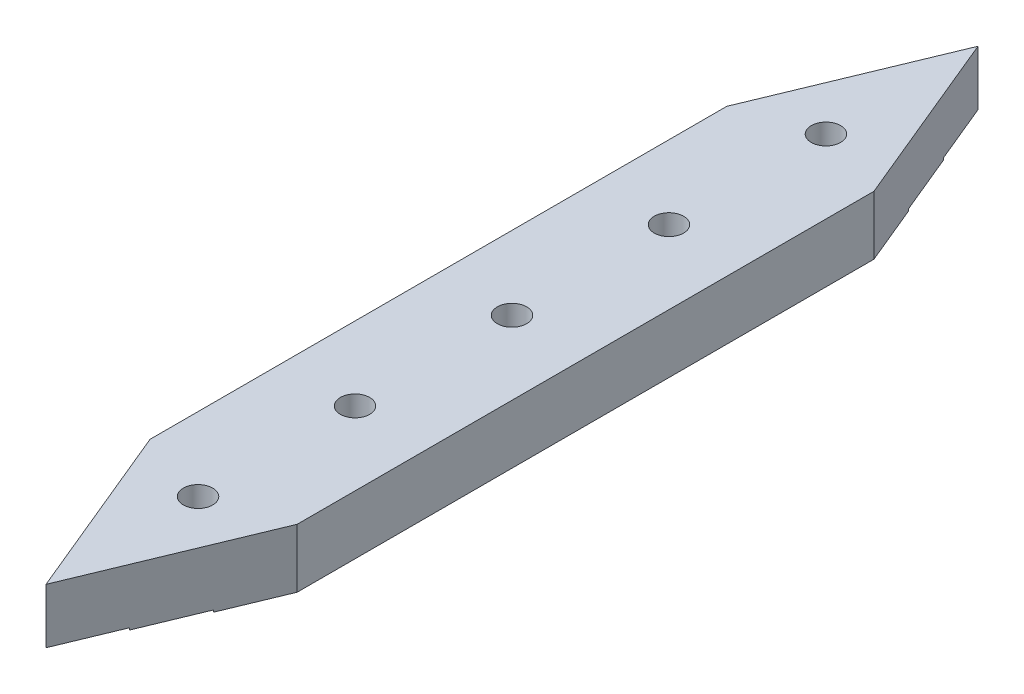
ISO-10303-21;
HEADER;
FILE_DESCRIPTION(('STEP AP214'),'2;1');
FILE_NAME('part.step','',(''),(''),'','','');
FILE_SCHEMA(('AUTOMOTIVE_DESIGN { 1 0 10303 214 1 1 1 1 }'));
ENDSEC;
DATA;
#1=APPLICATION_CONTEXT('core data for automotive mechanical design processes');
#2=APPLICATION_PROTOCOL_DEFINITION('international standard','automotive_design',2000,#1);
#3=PRODUCT_CONTEXT('',#1,'mechanical');
#4=PRODUCT('Part','Part','',(#3));
#5=PRODUCT_RELATED_PRODUCT_CATEGORY('part','',(#4));
#6=PRODUCT_DEFINITION_FORMATION('','',#4);
#7=PRODUCT_DEFINITION_CONTEXT('part definition',#1,'design');
#8=PRODUCT_DEFINITION('design','',#6,#7);
#9=PRODUCT_DEFINITION_SHAPE('','',#8);
#10=(LENGTH_UNIT() NAMED_UNIT(*) SI_UNIT(.MILLI.,.METRE.));
#11=(NAMED_UNIT(*) PLANE_ANGLE_UNIT() SI_UNIT($,.RADIAN.));
#12=(NAMED_UNIT(*) SI_UNIT($,.STERADIAN.) SOLID_ANGLE_UNIT());
#13=UNCERTAINTY_MEASURE_WITH_UNIT(LENGTH_MEASURE(1.E-05),#10,'distance_accuracy_value','');
#14=(GEOMETRIC_REPRESENTATION_CONTEXT(3) GLOBAL_UNCERTAINTY_ASSIGNED_CONTEXT((#13)) GLOBAL_UNIT_ASSIGNED_CONTEXT((#10,
#11,#12)) REPRESENTATION_CONTEXT('',''));
#15=CARTESIAN_POINT('',(0.,0.,0.));
#16=DIRECTION('',(0.,0.,1.));
#17=DIRECTION('',(1.,0.,0.));
#18=AXIS2_PLACEMENT_3D('',#15,#16,#17);
#19=CARTESIAN_POINT('',(0.,0.254,0.));
#20=DIRECTION('',(0.,-1.,0.));
#21=DIRECTION('',(0.,0.,-1.));
#22=AXIS2_PLACEMENT_3D('',#19,#20,#21);
#23=PLANE('',#22);
#24=DIRECTION('',(0.,0.,-1.));
#25=VECTOR('',#24,1.);
#26=CARTESIAN_POINT('',(-3.17499999999999,0.254,0.));
#27=LINE('',#26,#25);
#28=CARTESIAN_POINT('',(-3.175,0.254,52.6598719394655));
#29=VERTEX_POINT('',#28);
#30=CARTESIAN_POINT('',(-3.17499999999999,0.254,-52.6598719394654));
#31=VERTEX_POINT('',#30);
#32=EDGE_CURVE('E46',#29,#31,#27,.T.);
#33=ORIENTED_EDGE('',*,*,#32,.F.);
#34=DIRECTION('',(-0.38268343236509,0.,-0.923879532511287));
#35=VECTOR('',#34,1.);
#36=CARTESIAN_POINT('',(0.,0.254,60.325));
#37=LINE('',#36,#35);
#38=CARTESIAN_POINT('',(-6.35,0.254,44.9947438789308));
#39=VERTEX_POINT('',#38);
#40=EDGE_CURVE('E240',#29,#39,#37,.T.);
#41=ORIENTED_EDGE('',*,*,#40,.T.);
#42=DIRECTION('',(0.,0.,-1.));
#43=VECTOR('',#42,1.);
#44=CARTESIAN_POINT('',(-6.35,0.254,60.325));
#45=LINE('',#44,#43);
#46=CARTESIAN_POINT('',(-6.35000000000004,0.254,-44.9947438789306));
#47=VERTEX_POINT('',#46);
#48=EDGE_CURVE('E158',#39,#47,#45,.T.);
#49=ORIENTED_EDGE('',*,*,#48,.T.);
#50=DIRECTION('',(0.38268343236509,0.,-0.923879532511287));
#51=VECTOR('',#50,1.);
#52=CARTESIAN_POINT('',(0.,0.254,-60.325));
#53=LINE('',#52,#51);
#54=EDGE_CURVE('E242',#47,#31,#53,.T.);
#55=ORIENTED_EDGE('',*,*,#54,.T.);
#56=EDGE_LOOP('',(#33,#41,#49,#55));
#57=FACE_BOUND('',#56,.T.);
#58=ADVANCED_FACE('F37',(#57),#23,.T.);
#59=CARTESIAN_POINT('',(0.,0.,0.));
#60=DIRECTION('',(0.,1.,0.));
#61=DIRECTION('',(0.,0.,1.));
#62=AXIS2_PLACEMENT_3D('',#59,#60,#61);
#63=PLANE('',#62);
#64=DIRECTION('',(-0.38268343236509,0.,0.923879532511287));
#65=VECTOR('',#64,1.);
#66=CARTESIAN_POINT('',(0.,0.,-60.325));
#67=LINE('',#66,#65);
#68=CARTESIAN_POINT('',(-6.34999999999999,0.,-44.9947438789308));
#69=VERTEX_POINT('',#68);
#70=CARTESIAN_POINT('',(-9.52499999999999,0.,-37.3296158183963));
#71=VERTEX_POINT('',#70);
#72=EDGE_CURVE('E263',#69,#71,#67,.T.);
#73=ORIENTED_EDGE('',*,*,#72,.F.);
#74=DIRECTION('',(0.,0.,1.));
#75=VECTOR('',#74,1.);
#76=CARTESIAN_POINT('',(-6.34999999999999,0.,0.));
#77=LINE('',#76,#75);
#78=CARTESIAN_POINT('',(-6.35,0.,44.9947438789309));
#79=VERTEX_POINT('',#78);
#80=EDGE_CURVE('E167',#69,#79,#77,.T.);
#81=ORIENTED_EDGE('',*,*,#80,.T.);
#82=DIRECTION('',(0.38268343236509,0.,0.923879532511287));
#83=VECTOR('',#82,1.);
#84=CARTESIAN_POINT('',(0.,0.,60.325));
#85=LINE('',#84,#83);
#86=CARTESIAN_POINT('',(-9.52499999999999,0.,37.3296158183963));
#87=VERTEX_POINT('',#86);
#88=EDGE_CURVE('E267',#87,#79,#85,.T.);
#89=ORIENTED_EDGE('',*,*,#88,.F.);
#90=DIRECTION('',(0.,0.,1.));
#91=VECTOR('',#90,1.);
#92=CARTESIAN_POINT('',(-9.52499999999999,0.,-37.3296158183963));
#93=LINE('',#92,#91);
#94=EDGE_CURVE('E265',#71,#87,#93,.T.);
#95=ORIENTED_EDGE('',*,*,#94,.F.);
#96=EDGE_LOOP('',(#73,#81,#89,#95));
#97=FACE_BOUND('',#96,.T.);
#98=ADVANCED_FACE('F293',(#97),#63,.F.);
#99=CARTESIAN_POINT('',(0.,7.62,-60.325));
#100=DIRECTION('',(-0.923879532511287,0.,0.38268343236509));
#101=DIRECTION('',(0.38268343236509,0.,0.923879532511287));
#102=AXIS2_PLACEMENT_3D('',#99,#100,#101);
#103=PLANE('',#102);
#104=DIRECTION('',(0.38268343236509,0.,0.923879532511287));
#105=VECTOR('',#104,1.);
#106=CARTESIAN_POINT('',(0.,0.254,-60.325));
#107=LINE('',#106,#105);
#108=CARTESIAN_POINT('',(3.17500000000001,0.254,-52.6598719394654));
#109=VERTEX_POINT('',#108);
#110=CARTESIAN_POINT('',(6.35000000000007,0.254,-44.9947438789305));
#111=VERTEX_POINT('',#110);
#112=EDGE_CURVE('E245',#109,#111,#107,.T.);
#113=ORIENTED_EDGE('',*,*,#112,.F.);
#114=DIRECTION('',(0.,1.,0.));
#115=VECTOR('',#114,1.);
#116=CARTESIAN_POINT('',(3.17500000000001,7.62,-52.6598719394654));
#117=LINE('',#116,#115);
#118=CARTESIAN_POINT('',(3.17500000000006,0.508,-52.6598719394652));
#119=VERTEX_POINT('',#118);
#120=EDGE_CURVE('E54',#109,#119,#117,.T.);
#121=ORIENTED_EDGE('',*,*,#120,.T.);
#122=DIRECTION('',(0.38268343236509,0.,0.923879532511287));
#123=VECTOR('',#122,1.);
#124=CARTESIAN_POINT('',(0.,0.508,-60.325));
#125=LINE('',#124,#123);
#126=CARTESIAN_POINT('',(0.,0.508,-60.325));
#127=VERTEX_POINT('',#126);
#128=EDGE_CURVE('E145',#127,#119,#125,.T.);
#129=ORIENTED_EDGE('',*,*,#128,.F.);
#130=DIRECTION('',(0.,-1.,0.));
#131=VECTOR('',#130,1.);
#132=CARTESIAN_POINT('',(0.,7.62,-60.325));
#133=LINE('',#132,#131);
#134=CARTESIAN_POINT('',(0.,7.62,-60.325));
#135=VERTEX_POINT('',#134);
#136=EDGE_CURVE('E157',#135,#127,#133,.T.);
#137=ORIENTED_EDGE('',*,*,#136,.F.);
#138=DIRECTION('',(-0.38268343236509,0.,-0.923879532511287));
#139=VECTOR('',#138,1.);
#140=CARTESIAN_POINT('',(0.,7.62,-60.325));
#141=LINE('',#140,#139);
#142=CARTESIAN_POINT('',(9.525,7.62,-37.3296158183963));
#143=VERTEX_POINT('',#142);
#144=EDGE_CURVE('E248',#143,#135,#141,.T.);
#145=ORIENTED_EDGE('',*,*,#144,.F.);
#146=DIRECTION('',(0.,-1.,0.));
#147=VECTOR('',#146,1.);
#148=CARTESIAN_POINT('',(9.525,7.62,-37.3296158183963));
#149=LINE('',#148,#147);
#150=CARTESIAN_POINT('',(9.525,0.,-37.3296158183963));
#151=VERTEX_POINT('',#150);
#152=EDGE_CURVE('E260',#143,#151,#149,.T.);
#153=ORIENTED_EDGE('',*,*,#152,.T.);
#154=DIRECTION('',(-0.38268343236509,0.,-0.923879532511287));
#155=VECTOR('',#154,1.);
#156=CARTESIAN_POINT('',(0.,0.,-60.325));
#157=LINE('',#156,#155);
#158=CARTESIAN_POINT('',(6.35000000000001,0.,-44.9947438789308));
#159=VERTEX_POINT('',#158);
#160=EDGE_CURVE('E247',#151,#159,#157,.T.);
#161=ORIENTED_EDGE('',*,*,#160,.T.);
#162=DIRECTION('',(0.,1.,0.));
#163=VECTOR('',#162,1.);
#164=CARTESIAN_POINT('',(6.35000000000001,7.62,-44.9947438789308));
#165=LINE('',#164,#163);
#166=EDGE_CURVE('E62',#159,#111,#165,.T.);
#167=ORIENTED_EDGE('',*,*,#166,.T.);
#168=EDGE_LOOP('',(#113,#121,#129,#137,#145,#153,#161,#167));
#169=FACE_BOUND('',#168,.T.);
#170=ADVANCED_FACE('F39',(#169),#103,.F.);
#171=CARTESIAN_POINT('',(0.,7.62,-60.325));
#172=DIRECTION('',(0.923879532511287,0.,0.38268343236509));
#173=DIRECTION('',(0.38268343236509,0.,-0.923879532511287));
#174=AXIS2_PLACEMENT_3D('',#171,#172,#173);
#175=PLANE('',#174);
#176=DIRECTION('',(0.38268343236509,0.,-0.923879532511287));
#177=VECTOR('',#176,1.);
#178=CARTESIAN_POINT('',(0.,0.508,-60.325));
#179=LINE('',#178,#177);
#180=CARTESIAN_POINT('',(-3.17500000000003,0.508,-52.6598719394652));
#181=VERTEX_POINT('',#180);
#182=EDGE_CURVE('E141',#181,#127,#179,.T.);
#183=ORIENTED_EDGE('',*,*,#182,.F.);
#184=DIRECTION('',(0.,-1.,0.));
#185=VECTOR('',#184,1.);
#186=CARTESIAN_POINT('',(-3.17499999999999,7.62,-52.6598719394655));
#187=LINE('',#186,#185);
#188=EDGE_CURVE('E222',#181,#31,#187,.T.);
#189=ORIENTED_EDGE('',*,*,#188,.T.);
#190=ORIENTED_EDGE('',*,*,#54,.F.);
#191=DIRECTION('',(0.,-1.,0.));
#192=VECTOR('',#191,1.);
#193=CARTESIAN_POINT('',(-6.34999999999999,7.62,-44.9947438789309));
#194=LINE('',#193,#192);
#195=EDGE_CURVE('E237',#47,#69,#194,.T.);
#196=ORIENTED_EDGE('',*,*,#195,.T.);
#197=ORIENTED_EDGE('',*,*,#72,.T.);
#198=DIRECTION('',(0.,-1.,0.));
#199=VECTOR('',#198,1.);
#200=CARTESIAN_POINT('',(-9.52499999999999,7.62,-37.3296158183963));
#201=LINE('',#200,#199);
#202=CARTESIAN_POINT('',(-9.52499999999999,7.62,-37.3296158183963));
#203=VERTEX_POINT('',#202);
#204=EDGE_CURVE('E165',#203,#71,#201,.T.);
#205=ORIENTED_EDGE('',*,*,#204,.F.);
#206=DIRECTION('',(-0.38268343236509,0.,0.923879532511287));
#207=VECTOR('',#206,1.);
#208=CARTESIAN_POINT('',(0.,7.62,-60.325));
#209=LINE('',#208,#207);
#210=EDGE_CURVE('E162',#135,#203,#209,.T.);
#211=ORIENTED_EDGE('',*,*,#210,.F.);
#212=ORIENTED_EDGE('',*,*,#136,.T.);
#213=EDGE_LOOP('',(#183,#189,#190,#196,#197,#205,#211,#212));
#214=FACE_BOUND('',#213,.T.);
#215=ADVANCED_FACE('F160',(#214),#175,.F.);
#216=CARTESIAN_POINT('',(-9.52499999999999,7.62,-37.3296158183963));
#217=DIRECTION('',(1.,0.,0.));
#218=DIRECTION('',(0.,0.,-1.));
#219=AXIS2_PLACEMENT_3D('',#216,#217,#218);
#220=PLANE('',#219);
#221=ORIENTED_EDGE('',*,*,#94,.T.);
#222=DIRECTION('',(0.,-1.,0.));
#223=VECTOR('',#222,1.);
#224=CARTESIAN_POINT('',(-9.52499999999999,7.62,37.3296158183963));
#225=LINE('',#224,#223);
#226=CARTESIAN_POINT('',(-9.52499999999999,7.62,37.3296158183963));
#227=VERTEX_POINT('',#226);
#228=EDGE_CURVE('E170',#227,#87,#225,.T.);
#229=ORIENTED_EDGE('',*,*,#228,.F.);
#230=DIRECTION('',(0.,0.,1.));
#231=VECTOR('',#230,1.);
#232=CARTESIAN_POINT('',(-9.52499999999999,7.62,-37.3296158183963));
#233=LINE('',#232,#231);
#234=EDGE_CURVE('E252',#203,#227,#233,.T.);
#235=ORIENTED_EDGE('',*,*,#234,.F.);
#236=ORIENTED_EDGE('',*,*,#204,.T.);
#237=EDGE_LOOP('',(#221,#229,#235,#236));
#238=FACE_BOUND('',#237,.T.);
#239=ADVANCED_FACE('F345',(#238),#220,.F.);
#240=CARTESIAN_POINT('',(0.,7.62,60.325));
#241=DIRECTION('',(0.923879532511287,0.,-0.38268343236509));
#242=DIRECTION('',(-0.38268343236509,0.,-0.923879532511287));
#243=AXIS2_PLACEMENT_3D('',#240,#241,#242);
#244=PLANE('',#243);
#245=ORIENTED_EDGE('',*,*,#40,.F.);
#246=DIRECTION('',(0.,1.,0.));
#247=VECTOR('',#246,1.);
#248=CARTESIAN_POINT('',(-3.175,7.62,52.6598719394654));
#249=LINE('',#248,#247);
#250=CARTESIAN_POINT('',(-3.175,0.508,52.6598719394654));
#251=VERTEX_POINT('',#250);
#252=EDGE_CURVE('E219',#29,#251,#249,.T.);
#253=ORIENTED_EDGE('',*,*,#252,.T.);
#254=DIRECTION('',(-0.38268343236509,0.,-0.923879532511287));
#255=VECTOR('',#254,1.);
#256=CARTESIAN_POINT('',(0.,0.508,60.325));
#257=LINE('',#256,#255);
#258=CARTESIAN_POINT('',(0.,0.508,60.325));
#259=VERTEX_POINT('',#258);
#260=EDGE_CURVE('E151',#259,#251,#257,.T.);
#261=ORIENTED_EDGE('',*,*,#260,.F.);
#262=DIRECTION('',(0.,-1.,0.));
#263=VECTOR('',#262,1.);
#264=CARTESIAN_POINT('',(0.,7.62,60.325));
#265=LINE('',#264,#263);
#266=CARTESIAN_POINT('',(0.,7.62,60.325));
#267=VERTEX_POINT('',#266);
#268=EDGE_CURVE('E278',#267,#259,#265,.T.);
#269=ORIENTED_EDGE('',*,*,#268,.F.);
#270=DIRECTION('',(0.38268343236509,0.,0.923879532511287));
#271=VECTOR('',#270,1.);
#272=CARTESIAN_POINT('',(0.,7.62,60.325));
#273=LINE('',#272,#271);
#274=EDGE_CURVE('E254',#227,#267,#273,.T.);
#275=ORIENTED_EDGE('',*,*,#274,.F.);
#276=ORIENTED_EDGE('',*,*,#228,.T.);
#277=ORIENTED_EDGE('',*,*,#88,.T.);
#278=DIRECTION('',(0.,1.,0.));
#279=VECTOR('',#278,1.);
#280=CARTESIAN_POINT('',(-6.35,7.62,44.9947438789309));
#281=LINE('',#280,#279);
#282=EDGE_CURVE('E234',#79,#39,#281,.T.);
#283=ORIENTED_EDGE('',*,*,#282,.T.);
#284=EDGE_LOOP('',(#245,#253,#261,#269,#275,#276,#277,#283));
#285=FACE_BOUND('',#284,.T.);
#286=ADVANCED_FACE('F286',(#285),#244,.F.);
#287=CARTESIAN_POINT('',(0.,7.62,60.325));
#288=DIRECTION('',(-0.923879532511287,0.,-0.38268343236509));
#289=DIRECTION('',(-0.38268343236509,0.,0.923879532511287));
#290=AXIS2_PLACEMENT_3D('',#287,#288,#289);
#291=PLANE('',#290);
#292=DIRECTION('',(-0.38268343236509,0.,0.923879532511287));
#293=VECTOR('',#292,1.);
#294=CARTESIAN_POINT('',(0.,0.508,60.325));
#295=LINE('',#294,#293);
#296=CARTESIAN_POINT('',(3.175,0.508,52.6598719394654));
#297=VERTEX_POINT('',#296);
#298=EDGE_CURVE('E11',#297,#259,#295,.T.);
#299=ORIENTED_EDGE('',*,*,#298,.F.);
#300=DIRECTION('',(0.,-1.,0.));
#301=VECTOR('',#300,1.);
#302=CARTESIAN_POINT('',(3.175,7.62,52.6598719394654));
#303=LINE('',#302,#301);
#304=CARTESIAN_POINT('',(3.175,0.254,52.6598719394654));
#305=VERTEX_POINT('',#304);
#306=EDGE_CURVE('E215',#297,#305,#303,.T.);
#307=ORIENTED_EDGE('',*,*,#306,.T.);
#308=DIRECTION('',(-0.38268343236509,0.,0.923879532511287));
#309=VECTOR('',#308,1.);
#310=CARTESIAN_POINT('',(0.,0.254,60.325));
#311=LINE('',#310,#309);
#312=CARTESIAN_POINT('',(6.35,0.254,44.9947438789309));
#313=VERTEX_POINT('',#312);
#314=EDGE_CURVE('E176',#313,#305,#311,.T.);
#315=ORIENTED_EDGE('',*,*,#314,.F.);
#316=DIRECTION('',(0.,-1.,0.));
#317=VECTOR('',#316,1.);
#318=CARTESIAN_POINT('',(6.35,7.62,44.9947438789309));
#319=LINE('',#318,#317);
#320=CARTESIAN_POINT('',(6.35,0.,44.9947438789308));
#321=VERTEX_POINT('',#320);
#322=EDGE_CURVE('E230',#313,#321,#319,.T.);
#323=ORIENTED_EDGE('',*,*,#322,.T.);
#324=DIRECTION('',(0.38268343236509,0.,-0.923879532511287));
#325=VECTOR('',#324,1.);
#326=CARTESIAN_POINT('',(0.,0.,60.325));
#327=LINE('',#326,#325);
#328=CARTESIAN_POINT('',(9.525,0.,37.3296158183963));
#329=VERTEX_POINT('',#328);
#330=EDGE_CURVE('E270',#321,#329,#327,.T.);
#331=ORIENTED_EDGE('',*,*,#330,.T.);
#332=DIRECTION('',(0.,-1.,0.));
#333=VECTOR('',#332,1.);
#334=CARTESIAN_POINT('',(9.525,7.62,37.3296158183963));
#335=LINE('',#334,#333);
#336=CARTESIAN_POINT('',(9.525,7.62,37.3296158183963));
#337=VERTEX_POINT('',#336);
#338=EDGE_CURVE('E275',#337,#329,#335,.T.);
#339=ORIENTED_EDGE('',*,*,#338,.F.);
#340=DIRECTION('',(0.38268343236509,0.,-0.923879532511287));
#341=VECTOR('',#340,1.);
#342=CARTESIAN_POINT('',(0.,7.62,60.325));
#343=LINE('',#342,#341);
#344=EDGE_CURVE('E256',#267,#337,#343,.T.);
#345=ORIENTED_EDGE('',*,*,#344,.F.);
#346=ORIENTED_EDGE('',*,*,#268,.T.);
#347=EDGE_LOOP('',(#299,#307,#315,#323,#331,#339,#345,#346));
#348=FACE_BOUND('',#347,.T.);
#349=ADVANCED_FACE('F340',(#348),#291,.F.);
#350=CARTESIAN_POINT('',(9.525,7.62,-37.3296158183963));
#351=DIRECTION('',(-1.,0.,0.));
#352=DIRECTION('',(0.,0.,1.));
#353=AXIS2_PLACEMENT_3D('',#350,#351,#352);
#354=PLANE('',#353);
#355=DIRECTION('',(0.,0.,-1.));
#356=VECTOR('',#355,1.);
#357=CARTESIAN_POINT('',(9.525,0.,-37.3296158183963));
#358=LINE('',#357,#356);
#359=EDGE_CURVE('E250',#329,#151,#358,.T.);
#360=ORIENTED_EDGE('',*,*,#359,.T.);
#361=ORIENTED_EDGE('',*,*,#152,.F.);
#362=DIRECTION('',(0.,0.,-1.));
#363=VECTOR('',#362,1.);
#364=CARTESIAN_POINT('',(9.525,7.62,-37.3296158183963));
#365=LINE('',#364,#363);
#366=EDGE_CURVE('E258',#337,#143,#365,.T.);
#367=ORIENTED_EDGE('',*,*,#366,.F.);
#368=ORIENTED_EDGE('',*,*,#338,.T.);
#369=EDGE_LOOP('',(#360,#361,#367,#368));
#370=FACE_BOUND('',#369,.T.);
#371=ADVANCED_FACE('F356',(#370),#354,.F.);
#372=CARTESIAN_POINT('',(0.,7.62,0.));
#373=DIRECTION('',(0.,1.,0.));
#374=DIRECTION('',(0.,0.,1.));
#375=AXIS2_PLACEMENT_3D('',#372,#373,#374);
#376=PLANE('',#375);
#377=CARTESIAN_POINT('',(0.,7.62,-20.32));
#378=DIRECTION('',(0.,1.,0.));
#379=DIRECTION('',(0.,0.,1.));
#380=AXIS2_PLACEMENT_3D('',#377,#378,#379);
#381=CIRCLE('',#380,1.89865);
#382=CARTESIAN_POINT('',(0.,7.62,-18.42135));
#383=VERTEX_POINT('',#382);
#384=EDGE_CURVE('E200',#383,#383,#381,.T.);
#385=ORIENTED_EDGE('',*,*,#384,.F.);
#386=EDGE_LOOP('',(#385));
#387=FACE_BOUND('',#386,.T.);
#388=CARTESIAN_POINT('',(0.,7.62,-40.64));
#389=DIRECTION('',(0.,1.,0.));
#390=DIRECTION('',(0.,0.,1.));
#391=AXIS2_PLACEMENT_3D('',#388,#389,#390);
#392=CIRCLE('',#391,1.89865);
#393=CARTESIAN_POINT('',(0.,7.62,-38.74135));
#394=VERTEX_POINT('',#393);
#395=EDGE_CURVE('E189',#394,#394,#392,.T.);
#396=ORIENTED_EDGE('',*,*,#395,.F.);
#397=EDGE_LOOP('',(#396));
#398=FACE_BOUND('',#397,.T.);
#399=CARTESIAN_POINT('',(0.,7.62,0.));
#400=DIRECTION('',(0.,1.,0.));
#401=DIRECTION('',(0.,0.,1.));
#402=AXIS2_PLACEMENT_3D('',#399,#400,#401);
#403=CIRCLE('',#402,1.89865);
#404=CARTESIAN_POINT('',(0.,7.62,1.89865));
#405=VERTEX_POINT('',#404);
#406=EDGE_CURVE('E188',#405,#405,#403,.T.);
#407=ORIENTED_EDGE('',*,*,#406,.F.);
#408=EDGE_LOOP('',(#407));
#409=FACE_BOUND('',#408,.T.);
#410=CARTESIAN_POINT('',(0.,7.62,20.32));
#411=DIRECTION('',(0.,1.,0.));
#412=DIRECTION('',(0.,0.,1.));
#413=AXIS2_PLACEMENT_3D('',#410,#411,#412);
#414=CIRCLE('',#413,1.89865);
#415=CARTESIAN_POINT('',(0.,7.62,22.21865));
#416=VERTEX_POINT('',#415);
#417=EDGE_CURVE('E185',#416,#416,#414,.T.);
#418=ORIENTED_EDGE('',*,*,#417,.F.);
#419=EDGE_LOOP('',(#418));
#420=FACE_BOUND('',#419,.T.);
#421=CARTESIAN_POINT('',(0.,7.62,40.64));
#422=DIRECTION('',(0.,1.,0.));
#423=DIRECTION('',(0.,0.,1.));
#424=AXIS2_PLACEMENT_3D('',#421,#422,#423);
#425=CIRCLE('',#424,1.89865);
#426=CARTESIAN_POINT('',(0.,7.62,42.53865));
#427=VERTEX_POINT('',#426);
#428=EDGE_CURVE('E184',#427,#427,#425,.T.);
#429=ORIENTED_EDGE('',*,*,#428,.F.);
#430=EDGE_LOOP('',(#429));
#431=FACE_BOUND('',#430,.T.);
#432=ORIENTED_EDGE('',*,*,#144,.T.);
#433=ORIENTED_EDGE('',*,*,#210,.T.);
#434=ORIENTED_EDGE('',*,*,#234,.T.);
#435=ORIENTED_EDGE('',*,*,#274,.T.);
#436=ORIENTED_EDGE('',*,*,#344,.T.);
#437=ORIENTED_EDGE('',*,*,#366,.T.);
#438=EDGE_LOOP('',(#432,#433,#434,#435,#436,#437));
#439=FACE_BOUND('',#438,.T.);
#440=ADVANCED_FACE('F331',(#387,#398,#409,#420,#431,#439),#376,.T.);
#441=ORIENTED_EDGE('',*,*,#330,.F.);
#442=DIRECTION('',(0.,0.,-1.));
#443=VECTOR('',#442,1.);
#444=CARTESIAN_POINT('',(6.35000000000001,0.,0.));
#445=LINE('',#444,#443);
#446=EDGE_CURVE('E164',#321,#159,#445,.T.);
#447=ORIENTED_EDGE('',*,*,#446,.T.);
#448=ORIENTED_EDGE('',*,*,#160,.F.);
#449=ORIENTED_EDGE('',*,*,#359,.F.);
#450=EDGE_LOOP('',(#441,#447,#448,#449));
#451=FACE_BOUND('',#450,.T.);
#452=ADVANCED_FACE('F322',(#451),#63,.F.);
#453=DIRECTION('',(0.,0.,1.));
#454=VECTOR('',#453,1.);
#455=CARTESIAN_POINT('',(3.17500000000001,0.254,0.));
#456=LINE('',#455,#454);
#457=EDGE_CURVE('E179',#109,#305,#456,.T.);
#458=ORIENTED_EDGE('',*,*,#457,.F.);
#459=ORIENTED_EDGE('',*,*,#112,.T.);
#460=DIRECTION('',(0.,0.,1.));
#461=VECTOR('',#460,1.);
#462=CARTESIAN_POINT('',(6.35,0.254,60.325));
#463=LINE('',#462,#461);
#464=EDGE_CURVE('E227',#111,#313,#463,.T.);
#465=ORIENTED_EDGE('',*,*,#464,.T.);
#466=ORIENTED_EDGE('',*,*,#314,.T.);
#467=EDGE_LOOP('',(#458,#459,#465,#466));
#468=FACE_BOUND('',#467,.T.);
#469=ADVANCED_FACE('F317',(#468),#23,.T.);
#470=CARTESIAN_POINT('',(-6.35,0.254,60.325));
#471=DIRECTION('',(-1.,0.,0.));
#472=DIRECTION('',(0.,0.,1.));
#473=AXIS2_PLACEMENT_3D('',#470,#471,#472);
#474=PLANE('',#473);
#475=ORIENTED_EDGE('',*,*,#48,.F.);
#476=ORIENTED_EDGE('',*,*,#282,.F.);
#477=ORIENTED_EDGE('',*,*,#80,.F.);
#478=ORIENTED_EDGE('',*,*,#195,.F.);
#479=EDGE_LOOP('',(#475,#476,#477,#478));
#480=FACE_BOUND('',#479,.T.);
#481=ADVANCED_FACE('F296',(#480),#474,.F.);
#482=CARTESIAN_POINT('',(6.35,0.254,60.325));
#483=DIRECTION('',(1.,0.,0.));
#484=DIRECTION('',(0.,0.,-1.));
#485=AXIS2_PLACEMENT_3D('',#482,#483,#484);
#486=PLANE('',#485);
#487=ORIENTED_EDGE('',*,*,#446,.F.);
#488=ORIENTED_EDGE('',*,*,#322,.F.);
#489=ORIENTED_EDGE('',*,*,#464,.F.);
#490=ORIENTED_EDGE('',*,*,#166,.F.);
#491=EDGE_LOOP('',(#487,#488,#489,#490));
#492=FACE_BOUND('',#491,.T.);
#493=ADVANCED_FACE('F312',(#492),#486,.F.);
#494=CARTESIAN_POINT('',(0.,0.508,0.));
#495=DIRECTION('',(0.,-1.,0.));
#496=DIRECTION('',(0.,0.,-1.));
#497=AXIS2_PLACEMENT_3D('',#494,#495,#496);
#498=PLANE('',#497);
#499=CARTESIAN_POINT('',(0.,0.508,-20.32));
#500=DIRECTION('',(0.,-1.,0.));
#501=DIRECTION('',(0.,0.,-1.));
#502=AXIS2_PLACEMENT_3D('',#499,#500,#501);
#503=CIRCLE('',#502,1.89865);
#504=CARTESIAN_POINT('',(0.,0.508,-22.21865));
#505=VERTEX_POINT('',#504);
#506=EDGE_CURVE('E41',#505,#505,#503,.T.);
#507=ORIENTED_EDGE('',*,*,#506,.F.);
#508=EDGE_LOOP('',(#507));
#509=FACE_BOUND('',#508,.T.);
#510=CARTESIAN_POINT('',(0.,0.508,-40.64));
#511=DIRECTION('',(0.,-1.,0.));
#512=DIRECTION('',(0.,0.,-1.));
#513=AXIS2_PLACEMENT_3D('',#510,#511,#512);
#514=CIRCLE('',#513,1.89865);
#515=CARTESIAN_POINT('',(0.,0.508,-42.53865));
#516=VERTEX_POINT('',#515);
#517=EDGE_CURVE('E186',#516,#516,#514,.T.);
#518=ORIENTED_EDGE('',*,*,#517,.F.);
#519=EDGE_LOOP('',(#518));
#520=FACE_BOUND('',#519,.T.);
#521=CARTESIAN_POINT('',(0.,0.508,0.));
#522=DIRECTION('',(0.,-1.,0.));
#523=DIRECTION('',(0.,0.,-1.));
#524=AXIS2_PLACEMENT_3D('',#521,#522,#523);
#525=CIRCLE('',#524,1.89865);
#526=CARTESIAN_POINT('',(0.,0.508,-1.89865));
#527=VERTEX_POINT('',#526);
#528=EDGE_CURVE('E193',#527,#527,#525,.T.);
#529=ORIENTED_EDGE('',*,*,#528,.F.);
#530=EDGE_LOOP('',(#529));
#531=FACE_BOUND('',#530,.T.);
#532=CARTESIAN_POINT('',(0.,0.508,20.32));
#533=DIRECTION('',(0.,-1.,0.));
#534=DIRECTION('',(0.,0.,-1.));
#535=AXIS2_PLACEMENT_3D('',#532,#533,#534);
#536=CIRCLE('',#535,1.89865);
#537=CARTESIAN_POINT('',(0.,0.508,18.42135));
#538=VERTEX_POINT('',#537);
#539=EDGE_CURVE('E182',#538,#538,#536,.T.);
#540=ORIENTED_EDGE('',*,*,#539,.F.);
#541=EDGE_LOOP('',(#540));
#542=FACE_BOUND('',#541,.T.);
#543=CARTESIAN_POINT('',(0.,0.508,40.64));
#544=DIRECTION('',(0.,-1.,0.));
#545=DIRECTION('',(0.,0.,-1.));
#546=AXIS2_PLACEMENT_3D('',#543,#544,#545);
#547=CIRCLE('',#546,1.89865);
#548=CARTESIAN_POINT('',(0.,0.508,38.74135));
#549=VERTEX_POINT('',#548);
#550=EDGE_CURVE('E209',#549,#549,#547,.T.);
#551=ORIENTED_EDGE('',*,*,#550,.F.);
#552=EDGE_LOOP('',(#551));
#553=FACE_BOUND('',#552,.T.);
#554=ORIENTED_EDGE('',*,*,#128,.T.);
#555=DIRECTION('',(0.,0.,1.));
#556=VECTOR('',#555,1.);
#557=CARTESIAN_POINT('',(3.175,0.508,60.325));
#558=LINE('',#557,#556);
#559=EDGE_CURVE('E213',#119,#297,#558,.T.);
#560=ORIENTED_EDGE('',*,*,#559,.T.);
#561=ORIENTED_EDGE('',*,*,#298,.T.);
#562=ORIENTED_EDGE('',*,*,#260,.T.);
#563=DIRECTION('',(0.,0.,-1.));
#564=VECTOR('',#563,1.);
#565=CARTESIAN_POINT('',(-3.175,0.508,60.325));
#566=LINE('',#565,#564);
#567=EDGE_CURVE('E147',#251,#181,#566,.T.);
#568=ORIENTED_EDGE('',*,*,#567,.T.);
#569=ORIENTED_EDGE('',*,*,#182,.T.);
#570=EDGE_LOOP('',(#554,#560,#561,#562,#568,#569));
#571=FACE_BOUND('',#570,.T.);
#572=ADVANCED_FACE('F143',(#509,#520,#531,#542,#553,#571),#498,.T.);
#573=CARTESIAN_POINT('',(-3.175,0.508,60.325));
#574=DIRECTION('',(-1.,0.,0.));
#575=DIRECTION('',(0.,0.,1.));
#576=AXIS2_PLACEMENT_3D('',#573,#574,#575);
#577=PLANE('',#576);
#578=ORIENTED_EDGE('',*,*,#567,.F.);
#579=ORIENTED_EDGE('',*,*,#252,.F.);
#580=ORIENTED_EDGE('',*,*,#32,.T.);
#581=ORIENTED_EDGE('',*,*,#188,.F.);
#582=EDGE_LOOP('',(#578,#579,#580,#581));
#583=FACE_BOUND('',#582,.T.);
#584=ADVANCED_FACE('F302',(#583),#577,.F.);
#585=CARTESIAN_POINT('',(3.175,0.508,60.325));
#586=DIRECTION('',(1.,0.,0.));
#587=DIRECTION('',(0.,0.,-1.));
#588=AXIS2_PLACEMENT_3D('',#585,#586,#587);
#589=PLANE('',#588);
#590=ORIENTED_EDGE('',*,*,#457,.T.);
#591=ORIENTED_EDGE('',*,*,#306,.F.);
#592=ORIENTED_EDGE('',*,*,#559,.F.);
#593=ORIENTED_EDGE('',*,*,#120,.F.);
#594=EDGE_LOOP('',(#590,#591,#592,#593));
#595=FACE_BOUND('',#594,.T.);
#596=ADVANCED_FACE('F304',(#595),#589,.F.);
#597=CARTESIAN_POINT('',(0.,7.62,40.64));
#598=DIRECTION('',(0.,1.,0.));
#599=DIRECTION('',(0.,0.,1.));
#600=AXIS2_PLACEMENT_3D('',#597,#598,#599);
#601=CYLINDRICAL_SURFACE('',#600,1.89865);
#602=ORIENTED_EDGE('',*,*,#550,.T.);
#603=EDGE_LOOP('',(#602));
#604=FACE_BOUND('',#603,.T.);
#605=ORIENTED_EDGE('',*,*,#428,.T.);
#606=EDGE_LOOP('',(#605));
#607=FACE_BOUND('',#606,.T.);
#608=ADVANCED_FACE('F310',(#604,#607),#601,.F.);
#609=CARTESIAN_POINT('',(0.,7.62,20.32));
#610=DIRECTION('',(0.,1.,0.));
#611=DIRECTION('',(0.,0.,1.));
#612=AXIS2_PLACEMENT_3D('',#609,#610,#611);
#613=CYLINDRICAL_SURFACE('',#612,1.89865);
#614=ORIENTED_EDGE('',*,*,#539,.T.);
#615=EDGE_LOOP('',(#614));
#616=FACE_BOUND('',#615,.T.);
#617=ORIENTED_EDGE('',*,*,#417,.T.);
#618=EDGE_LOOP('',(#617));
#619=FACE_BOUND('',#618,.T.);
#620=ADVANCED_FACE('F387',(#616,#619),#613,.F.);
#621=CARTESIAN_POINT('',(0.,7.62,0.));
#622=DIRECTION('',(0.,1.,0.));
#623=DIRECTION('',(0.,0.,1.));
#624=AXIS2_PLACEMENT_3D('',#621,#622,#623);
#625=CYLINDRICAL_SURFACE('',#624,1.89865);
#626=ORIENTED_EDGE('',*,*,#528,.T.);
#627=EDGE_LOOP('',(#626));
#628=FACE_BOUND('',#627,.T.);
#629=ORIENTED_EDGE('',*,*,#406,.T.);
#630=EDGE_LOOP('',(#629));
#631=FACE_BOUND('',#630,.T.);
#632=ADVANCED_FACE('F400',(#628,#631),#625,.F.);
#633=CARTESIAN_POINT('',(0.,7.62,-40.64));
#634=DIRECTION('',(0.,1.,0.));
#635=DIRECTION('',(0.,0.,1.));
#636=AXIS2_PLACEMENT_3D('',#633,#634,#635);
#637=CYLINDRICAL_SURFACE('',#636,1.89865);
#638=ORIENTED_EDGE('',*,*,#517,.T.);
#639=EDGE_LOOP('',(#638));
#640=FACE_BOUND('',#639,.T.);
#641=ORIENTED_EDGE('',*,*,#395,.T.);
#642=EDGE_LOOP('',(#641));
#643=FACE_BOUND('',#642,.T.);
#644=ADVANCED_FACE('F411',(#640,#643),#637,.F.);
#645=CARTESIAN_POINT('',(0.,7.62,-20.32));
#646=DIRECTION('',(0.,1.,0.));
#647=DIRECTION('',(0.,0.,1.));
#648=AXIS2_PLACEMENT_3D('',#645,#646,#647);
#649=CYLINDRICAL_SURFACE('',#648,1.89865);
#650=ORIENTED_EDGE('',*,*,#506,.T.);
#651=EDGE_LOOP('',(#650));
#652=FACE_BOUND('',#651,.T.);
#653=ORIENTED_EDGE('',*,*,#384,.T.);
#654=EDGE_LOOP('',(#653));
#655=FACE_BOUND('',#654,.T.);
#656=ADVANCED_FACE('F422',(#652,#655),#649,.F.);
#657=CLOSED_SHELL('',(#58,#98,#170,#215,#239,#286,#349,#371,#440,#452,#469,#481,#493,#572,#584,
#596,#608,#620,#632,#644,#656));
#658=MANIFOLD_SOLID_BREP('B2',#657);
#659=ADVANCED_BREP_SHAPE_REPRESENTATION('',(#18,#658),#14);
#660=SHAPE_DEFINITION_REPRESENTATION(#9,#659);
ENDSEC;
END-ISO-10303-21;
